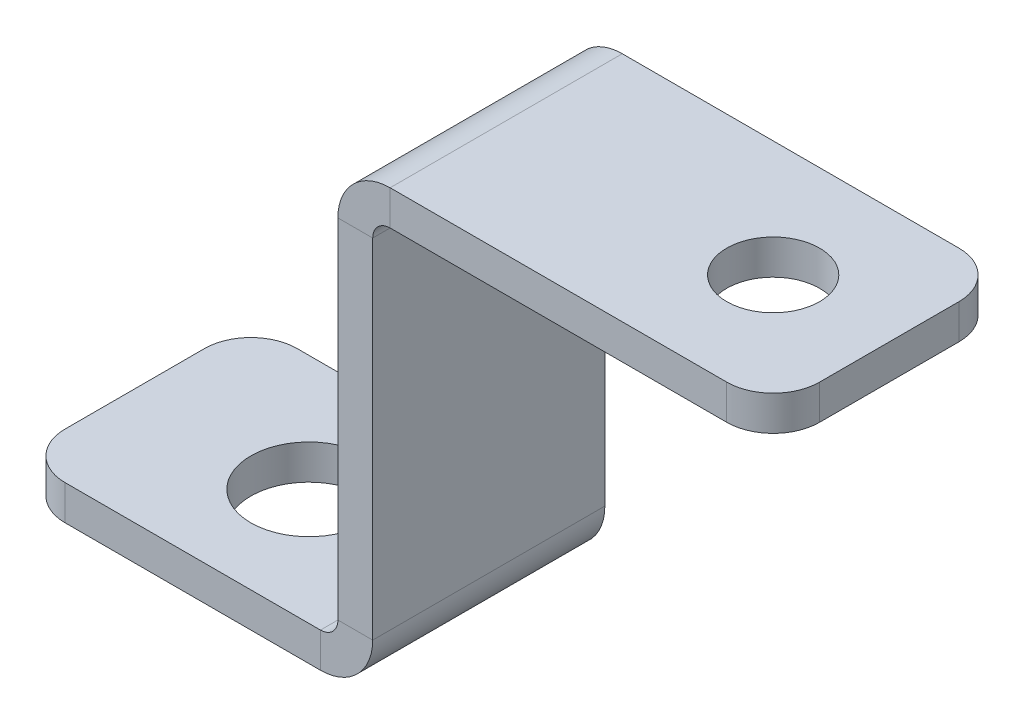
ISO-10303-21;
HEADER;
FILE_DESCRIPTION(('STEP AP214'),'2;1');
FILE_NAME('part.step','',(''),(''),'','','');
FILE_SCHEMA(('AUTOMOTIVE_DESIGN { 1 0 10303 214 1 1 1 1 }'));
ENDSEC;
DATA;
#1=APPLICATION_CONTEXT('core data for automotive mechanical design processes');
#2=APPLICATION_PROTOCOL_DEFINITION('international standard','automotive_design',2000,#1);
#3=PRODUCT_CONTEXT('',#1,'mechanical');
#4=PRODUCT('Part','Part','',(#3));
#5=PRODUCT_RELATED_PRODUCT_CATEGORY('part','',(#4));
#6=PRODUCT_DEFINITION_FORMATION('','',#4);
#7=PRODUCT_DEFINITION_CONTEXT('part definition',#1,'design');
#8=PRODUCT_DEFINITION('design','',#6,#7);
#9=PRODUCT_DEFINITION_SHAPE('','',#8);
#10=(LENGTH_UNIT() NAMED_UNIT(*) SI_UNIT(.MILLI.,.METRE.));
#11=(NAMED_UNIT(*) PLANE_ANGLE_UNIT() SI_UNIT($,.RADIAN.));
#12=(NAMED_UNIT(*) SI_UNIT($,.STERADIAN.) SOLID_ANGLE_UNIT());
#13=UNCERTAINTY_MEASURE_WITH_UNIT(LENGTH_MEASURE(1.E-05),#10,'distance_accuracy_value','');
#14=(GEOMETRIC_REPRESENTATION_CONTEXT(3) GLOBAL_UNCERTAINTY_ASSIGNED_CONTEXT((#13)) GLOBAL_UNIT_ASSIGNED_CONTEXT((#10,
#11,#12)) REPRESENTATION_CONTEXT('',''));
#15=CARTESIAN_POINT('',(0.,0.,0.));
#16=DIRECTION('',(0.,0.,1.));
#17=DIRECTION('',(1.,0.,0.));
#18=AXIS2_PLACEMENT_3D('',#15,#16,#17);
#19=CARTESIAN_POINT('',(13.75,0.75,10.));
#20=DIRECTION('',(0.,0.,1.));
#21=DIRECTION('',(1.,0.,0.));
#22=AXIS2_PLACEMENT_3D('',#19,#20,#21);
#23=PLANE('',#22);
#24=DIRECTION('',(1.,0.,0.));
#25=VECTOR('',#24,1.);
#26=CARTESIAN_POINT('',(13.75,0.75,10.));
#27=LINE('',#26,#25);
#28=CARTESIAN_POINT('',(13.75,0.75,10.));
#29=VERTEX_POINT('',#28);
#30=CARTESIAN_POINT('',(15.25,0.75,10.));
#31=VERTEX_POINT('',#30);
#32=EDGE_CURVE('E318',#29,#31,#27,.T.);
#33=ORIENTED_EDGE('',*,*,#32,.F.);
#34=CARTESIAN_POINT('',(13.,0.75,10.));
#35=DIRECTION('',(0.,0.,-1.));
#36=DIRECTION('',(-1.,0.,0.));
#37=AXIS2_PLACEMENT_3D('',#34,#35,#36);
#38=CIRCLE('',#37,0.75);
#39=CARTESIAN_POINT('',(13.,0.,10.));
#40=VERTEX_POINT('',#39);
#41=EDGE_CURVE('E203',#40,#29,#38,.F.);
#42=ORIENTED_EDGE('',*,*,#41,.F.);
#43=DIRECTION('',(0.,1.,0.));
#44=VECTOR('',#43,1.);
#45=CARTESIAN_POINT('',(13.,-1.5,10.));
#46=LINE('',#45,#44);
#47=CARTESIAN_POINT('',(13.,-1.5,10.));
#48=VERTEX_POINT('',#47);
#49=EDGE_CURVE('E314',#48,#40,#46,.T.);
#50=ORIENTED_EDGE('',*,*,#49,.F.);
#51=CARTESIAN_POINT('',(13.,0.75,10.));
#52=DIRECTION('',(0.,0.,1.));
#53=DIRECTION('',(1.,0.,0.));
#54=AXIS2_PLACEMENT_3D('',#51,#52,#53);
#55=CIRCLE('',#54,2.25);
#56=EDGE_CURVE('E216',#48,#31,#55,.T.);
#57=ORIENTED_EDGE('',*,*,#56,.T.);
#58=EDGE_LOOP('',(#33,#42,#50,#57));
#59=FACE_BOUND('',#58,.T.);
#60=ADVANCED_FACE('F41',(#59),#23,.T.);
#61=CARTESIAN_POINT('',(13.,-1.5,10.));
#62=DIRECTION('',(0.,0.,1.));
#63=DIRECTION('',(1.,0.,0.));
#64=AXIS2_PLACEMENT_3D('',#61,#62,#63);
#65=PLANE('',#64);
#66=DIRECTION('',(0.,1.,0.));
#67=VECTOR('',#66,1.);
#68=CARTESIAN_POINT('',(13.75,0.,10.));
#69=LINE('',#68,#67);
#70=CARTESIAN_POINT('',(13.75,15.75,10.));
#71=VERTEX_POINT('',#70);
#72=EDGE_CURVE('E200',#29,#71,#69,.T.);
#73=ORIENTED_EDGE('',*,*,#72,.F.);
#74=ORIENTED_EDGE('',*,*,#32,.T.);
#75=DIRECTION('',(0.,1.,0.));
#76=VECTOR('',#75,1.);
#77=CARTESIAN_POINT('',(15.25,0.,10.));
#78=LINE('',#77,#76);
#79=CARTESIAN_POINT('',(15.25,15.75,10.));
#80=VERTEX_POINT('',#79);
#81=EDGE_CURVE('E220',#31,#80,#78,.T.);
#82=ORIENTED_EDGE('',*,*,#81,.T.);
#83=DIRECTION('',(-1.,0.,0.));
#84=VECTOR('',#83,1.);
#85=CARTESIAN_POINT('',(15.25,15.75,10.));
#86=LINE('',#85,#84);
#87=EDGE_CURVE('E170',#80,#71,#86,.T.);
#88=ORIENTED_EDGE('',*,*,#87,.T.);
#89=EDGE_LOOP('',(#73,#74,#82,#88));
#90=FACE_BOUND('',#89,.T.);
#91=ADVANCED_FACE('F400',(#90),#65,.T.);
#92=CARTESIAN_POINT('',(13.,0.,0.));
#93=DIRECTION('',(0.,0.,-1.));
#94=DIRECTION('',(-1.,0.,0.));
#95=AXIS2_PLACEMENT_3D('',#92,#93,#94);
#96=PLANE('',#95);
#97=DIRECTION('',(0.,-1.,0.));
#98=VECTOR('',#97,1.);
#99=CARTESIAN_POINT('',(13.,0.,0.));
#100=LINE('',#99,#98);
#101=CARTESIAN_POINT('',(13.,0.,0.));
#102=VERTEX_POINT('',#101);
#103=CARTESIAN_POINT('',(13.,-1.5,0.));
#104=VERTEX_POINT('',#103);
#105=EDGE_CURVE('E310',#102,#104,#100,.T.);
#106=ORIENTED_EDGE('',*,*,#105,.F.);
#107=CARTESIAN_POINT('',(13.,0.75,0.));
#108=DIRECTION('',(0.,0.,-1.));
#109=DIRECTION('',(-1.,0.,0.));
#110=AXIS2_PLACEMENT_3D('',#107,#108,#109);
#111=CIRCLE('',#110,0.75);
#112=CARTESIAN_POINT('',(13.75,0.75,0.));
#113=VERTEX_POINT('',#112);
#114=EDGE_CURVE('E241',#102,#113,#111,.F.);
#115=ORIENTED_EDGE('',*,*,#114,.T.);
#116=DIRECTION('',(-1.,0.,0.));
#117=VECTOR('',#116,1.);
#118=CARTESIAN_POINT('',(15.25,0.75,0.));
#119=LINE('',#118,#117);
#120=CARTESIAN_POINT('',(15.25,0.75,0.));
#121=VERTEX_POINT('',#120);
#122=EDGE_CURVE('E169',#121,#113,#119,.T.);
#123=ORIENTED_EDGE('',*,*,#122,.F.);
#124=CARTESIAN_POINT('',(13.,0.75,0.));
#125=DIRECTION('',(0.,0.,1.));
#126=DIRECTION('',(1.,0.,0.));
#127=AXIS2_PLACEMENT_3D('',#124,#125,#126);
#128=CIRCLE('',#127,2.25);
#129=EDGE_CURVE('E251',#104,#121,#128,.T.);
#130=ORIENTED_EDGE('',*,*,#129,.F.);
#131=EDGE_LOOP('',(#106,#115,#123,#130));
#132=FACE_BOUND('',#131,.T.);
#133=ADVANCED_FACE('F450',(#132),#96,.T.);
#134=CARTESIAN_POINT('',(15.25,0.75,0.));
#135=DIRECTION('',(0.,0.,-1.));
#136=DIRECTION('',(-1.,0.,0.));
#137=AXIS2_PLACEMENT_3D('',#134,#135,#136);
#138=PLANE('',#137);
#139=DIRECTION('',(1.,0.,0.));
#140=VECTOR('',#139,1.);
#141=CARTESIAN_POINT('',(0.,-1.5,0.));
#142=LINE('',#141,#140);
#143=CARTESIAN_POINT('',(2.,-1.5,0.));
#144=VERTEX_POINT('',#143);
#145=EDGE_CURVE('E248',#144,#104,#142,.T.);
#146=ORIENTED_EDGE('',*,*,#145,.F.);
#147=DIRECTION('',(0.,1.,0.));
#148=VECTOR('',#147,1.);
#149=CARTESIAN_POINT('',(2.,0.75,0.));
#150=LINE('',#149,#148);
#151=CARTESIAN_POINT('',(2.,0.,0.));
#152=VERTEX_POINT('',#151);
#153=EDGE_CURVE('E346',#144,#152,#150,.T.);
#154=ORIENTED_EDGE('',*,*,#153,.T.);
#155=DIRECTION('',(1.,0.,0.));
#156=VECTOR('',#155,1.);
#157=CARTESIAN_POINT('',(0.,0.,0.));
#158=LINE('',#157,#156);
#159=EDGE_CURVE('E245',#152,#102,#158,.T.);
#160=ORIENTED_EDGE('',*,*,#159,.T.);
#161=ORIENTED_EDGE('',*,*,#105,.T.);
#162=EDGE_LOOP('',(#146,#154,#160,#161));
#163=FACE_BOUND('',#162,.T.);
#164=ADVANCED_FACE('F373',(#163),#138,.T.);
#165=CARTESIAN_POINT('',(16.,18.,10.));
#166=DIRECTION('',(0.,0.,1.));
#167=DIRECTION('',(1.,0.,0.));
#168=AXIS2_PLACEMENT_3D('',#165,#166,#167);
#169=PLANE('',#168);
#170=DIRECTION('',(0.,-1.,0.));
#171=VECTOR('',#170,1.);
#172=CARTESIAN_POINT('',(16.,18.,10.));
#173=LINE('',#172,#171);
#174=CARTESIAN_POINT('',(16.,18.,10.));
#175=VERTEX_POINT('',#174);
#176=CARTESIAN_POINT('',(16.,16.5,10.));
#177=VERTEX_POINT('',#176);
#178=EDGE_CURVE('E156',#175,#177,#173,.T.);
#179=ORIENTED_EDGE('',*,*,#178,.F.);
#180=CARTESIAN_POINT('',(16.,15.75,10.));
#181=DIRECTION('',(0.,0.,1.));
#182=DIRECTION('',(1.,0.,0.));
#183=AXIS2_PLACEMENT_3D('',#180,#181,#182);
#184=CIRCLE('',#183,2.25);
#185=EDGE_CURVE('E160',#71,#175,#184,.F.);
#186=ORIENTED_EDGE('',*,*,#185,.F.);
#187=ORIENTED_EDGE('',*,*,#87,.F.);
#188=CARTESIAN_POINT('',(16.,15.75,10.));
#189=DIRECTION('',(0.,0.,1.));
#190=DIRECTION('',(1.,0.,0.));
#191=AXIS2_PLACEMENT_3D('',#188,#189,#190);
#192=CIRCLE('',#191,0.75);
#193=EDGE_CURVE('E163',#80,#177,#192,.F.);
#194=ORIENTED_EDGE('',*,*,#193,.T.);
#195=EDGE_LOOP('',(#179,#186,#187,#194));
#196=FACE_BOUND('',#195,.T.);
#197=ADVANCED_FACE('F158',(#196),#169,.T.);
#198=CARTESIAN_POINT('',(15.25,15.75,10.));
#199=DIRECTION('',(0.,0.,1.));
#200=DIRECTION('',(1.,0.,0.));
#201=AXIS2_PLACEMENT_3D('',#198,#199,#200);
#202=PLANE('',#201);
#203=DIRECTION('',(1.,0.,0.));
#204=VECTOR('',#203,1.);
#205=CARTESIAN_POINT('',(13.75,16.5,10.));
#206=LINE('',#205,#204);
#207=CARTESIAN_POINT('',(30.5,16.5,10.));
#208=VERTEX_POINT('',#207);
#209=EDGE_CURVE('E194',#177,#208,#206,.T.);
#210=ORIENTED_EDGE('',*,*,#209,.T.);
#211=DIRECTION('',(0.,-1.,0.));
#212=VECTOR('',#211,1.);
#213=CARTESIAN_POINT('',(30.5,15.75,10.));
#214=LINE('',#213,#212);
#215=CARTESIAN_POINT('',(30.5,18.,10.));
#216=VERTEX_POINT('',#215);
#217=EDGE_CURVE('E192',#208,#216,#214,.F.);
#218=ORIENTED_EDGE('',*,*,#217,.T.);
#219=DIRECTION('',(1.,0.,0.));
#220=VECTOR('',#219,1.);
#221=CARTESIAN_POINT('',(13.75,18.,10.));
#222=LINE('',#221,#220);
#223=EDGE_CURVE('E179',#175,#216,#222,.T.);
#224=ORIENTED_EDGE('',*,*,#223,.F.);
#225=ORIENTED_EDGE('',*,*,#178,.T.);
#226=EDGE_LOOP('',(#210,#218,#224,#225));
#227=FACE_BOUND('',#226,.T.);
#228=ADVANCED_FACE('F190',(#227),#202,.T.);
#229=CARTESIAN_POINT('',(13.75,15.75,0.));
#230=DIRECTION('',(0.,0.,-1.));
#231=DIRECTION('',(-1.,0.,0.));
#232=AXIS2_PLACEMENT_3D('',#229,#230,#231);
#233=PLANE('',#232);
#234=DIRECTION('',(1.,0.,0.));
#235=VECTOR('',#234,1.);
#236=CARTESIAN_POINT('',(13.75,15.75,0.));
#237=LINE('',#236,#235);
#238=CARTESIAN_POINT('',(13.75,15.75,0.));
#239=VERTEX_POINT('',#238);
#240=CARTESIAN_POINT('',(15.25,15.75,0.));
#241=VERTEX_POINT('',#240);
#242=EDGE_CURVE('E303',#239,#241,#237,.T.);
#243=ORIENTED_EDGE('',*,*,#242,.F.);
#244=CARTESIAN_POINT('',(16.,15.75,0.));
#245=DIRECTION('',(0.,0.,1.));
#246=DIRECTION('',(1.,0.,0.));
#247=AXIS2_PLACEMENT_3D('',#244,#245,#246);
#248=CIRCLE('',#247,2.25);
#249=CARTESIAN_POINT('',(16.,18.,0.));
#250=VERTEX_POINT('',#249);
#251=EDGE_CURVE('E234',#239,#250,#248,.F.);
#252=ORIENTED_EDGE('',*,*,#251,.T.);
#253=DIRECTION('',(0.,1.,0.));
#254=VECTOR('',#253,1.);
#255=CARTESIAN_POINT('',(16.,16.5,0.));
#256=LINE('',#255,#254);
#257=CARTESIAN_POINT('',(16.,16.5,0.));
#258=VERTEX_POINT('',#257);
#259=EDGE_CURVE('E300',#258,#250,#256,.T.);
#260=ORIENTED_EDGE('',*,*,#259,.F.);
#261=CARTESIAN_POINT('',(16.,15.75,0.));
#262=DIRECTION('',(0.,0.,1.));
#263=DIRECTION('',(1.,0.,0.));
#264=AXIS2_PLACEMENT_3D('',#261,#262,#263);
#265=CIRCLE('',#264,0.75);
#266=EDGE_CURVE('E259',#241,#258,#265,.F.);
#267=ORIENTED_EDGE('',*,*,#266,.F.);
#268=EDGE_LOOP('',(#243,#252,#260,#267));
#269=FACE_BOUND('',#268,.T.);
#270=ADVANCED_FACE('F579',(#269),#233,.T.);
#271=CARTESIAN_POINT('',(16.,16.5,0.));
#272=DIRECTION('',(0.,0.,-1.));
#273=DIRECTION('',(-1.,0.,0.));
#274=AXIS2_PLACEMENT_3D('',#271,#272,#273);
#275=PLANE('',#274);
#276=DIRECTION('',(0.,1.,0.));
#277=VECTOR('',#276,1.);
#278=CARTESIAN_POINT('',(13.75,0.,0.));
#279=LINE('',#278,#277);
#280=EDGE_CURVE('E237',#113,#239,#279,.T.);
#281=ORIENTED_EDGE('',*,*,#280,.T.);
#282=ORIENTED_EDGE('',*,*,#242,.T.);
#283=DIRECTION('',(0.,1.,0.));
#284=VECTOR('',#283,1.);
#285=CARTESIAN_POINT('',(15.25,0.,0.));
#286=LINE('',#285,#284);
#287=EDGE_CURVE('E255',#121,#241,#286,.T.);
#288=ORIENTED_EDGE('',*,*,#287,.F.);
#289=ORIENTED_EDGE('',*,*,#122,.T.);
#290=EDGE_LOOP('',(#281,#282,#288,#289));
#291=FACE_BOUND('',#290,.T.);
#292=ADVANCED_FACE('F566',(#291),#275,.T.);
#293=CARTESIAN_POINT('',(13.75,16.5,10.));
#294=DIRECTION('',(0.,1.,0.));
#295=DIRECTION('',(0.,0.,1.));
#296=AXIS2_PLACEMENT_3D('',#293,#294,#295);
#297=PLANE('',#296);
#298=CARTESIAN_POINT('',(27.5,16.5,5.));
#299=DIRECTION('',(0.,1.,0.));
#300=DIRECTION('',(0.,0.,1.));
#301=AXIS2_PLACEMENT_3D('',#298,#299,#300);
#302=CIRCLE('',#301,2.);
#303=CARTESIAN_POINT('',(27.5,16.5,7.));
#304=VERTEX_POINT('',#303);
#305=EDGE_CURVE('E420',#304,#304,#302,.T.);
#306=ORIENTED_EDGE('',*,*,#305,.T.);
#307=EDGE_LOOP('',(#306));
#308=FACE_BOUND('',#307,.T.);
#309=DIRECTION('',(1.,0.,0.));
#310=VECTOR('',#309,1.);
#311=CARTESIAN_POINT('',(13.75,16.5,0.));
#312=LINE('',#311,#310);
#313=CARTESIAN_POINT('',(30.5,16.5,0.));
#314=VERTEX_POINT('',#313);
#315=EDGE_CURVE('E227',#258,#314,#312,.T.);
#316=ORIENTED_EDGE('',*,*,#315,.T.);
#317=CARTESIAN_POINT('',(30.5,16.5,2.));
#318=DIRECTION('',(0.,1.,0.));
#319=DIRECTION('',(0.,0.,1.));
#320=AXIS2_PLACEMENT_3D('',#317,#318,#319);
#321=CIRCLE('',#320,2.);
#322=CARTESIAN_POINT('',(32.5,16.5,2.));
#323=VERTEX_POINT('',#322);
#324=EDGE_CURVE('E328',#314,#323,#321,.F.);
#325=ORIENTED_EDGE('',*,*,#324,.T.);
#326=DIRECTION('',(0.,0.,-1.));
#327=VECTOR('',#326,1.);
#328=CARTESIAN_POINT('',(32.5,16.5,10.));
#329=LINE('',#328,#327);
#330=CARTESIAN_POINT('',(32.5,16.5,8.));
#331=VERTEX_POINT('',#330);
#332=EDGE_CURVE('E296',#331,#323,#329,.T.);
#333=ORIENTED_EDGE('',*,*,#332,.F.);
#334=CARTESIAN_POINT('',(30.5,16.5,8.));
#335=DIRECTION('',(0.,1.,0.));
#336=DIRECTION('',(0.,0.,1.));
#337=AXIS2_PLACEMENT_3D('',#334,#335,#336);
#338=CIRCLE('',#337,2.);
#339=EDGE_CURVE('E325',#331,#208,#338,.F.);
#340=ORIENTED_EDGE('',*,*,#339,.T.);
#341=ORIENTED_EDGE('',*,*,#209,.F.);
#342=DIRECTION('',(0.,0.,-1.));
#343=VECTOR('',#342,1.);
#344=CARTESIAN_POINT('',(16.,16.5,10.));
#345=LINE('',#344,#343);
#346=EDGE_CURVE('E226',#177,#258,#345,.T.);
#347=ORIENTED_EDGE('',*,*,#346,.T.);
#348=EDGE_LOOP('',(#316,#325,#333,#340,#341,#347));
#349=FACE_BOUND('',#348,.T.);
#350=ADVANCED_FACE('F412',(#308,#349),#297,.F.);
#351=CARTESIAN_POINT('',(32.5,18.,10.));
#352=DIRECTION('',(1.,0.,0.));
#353=DIRECTION('',(0.,0.,-1.));
#354=AXIS2_PLACEMENT_3D('',#351,#352,#353);
#355=PLANE('',#354);
#356=ORIENTED_EDGE('',*,*,#332,.T.);
#357=DIRECTION('',(0.,-1.,0.));
#358=VECTOR('',#357,1.);
#359=CARTESIAN_POINT('',(32.5,18.,2.));
#360=LINE('',#359,#358);
#361=CARTESIAN_POINT('',(32.5,18.,2.));
#362=VERTEX_POINT('',#361);
#363=EDGE_CURVE('E335',#323,#362,#360,.F.);
#364=ORIENTED_EDGE('',*,*,#363,.T.);
#365=DIRECTION('',(0.,0.,-1.));
#366=VECTOR('',#365,1.);
#367=CARTESIAN_POINT('',(32.5,18.,10.));
#368=LINE('',#367,#366);
#369=CARTESIAN_POINT('',(32.5,18.,8.));
#370=VERTEX_POINT('',#369);
#371=EDGE_CURVE('E187',#370,#362,#368,.T.);
#372=ORIENTED_EDGE('',*,*,#371,.F.);
#373=DIRECTION('',(0.,-1.,0.));
#374=VECTOR('',#373,1.);
#375=CARTESIAN_POINT('',(32.5,18.,8.));
#376=LINE('',#375,#374);
#377=EDGE_CURVE('E331',#370,#331,#376,.T.);
#378=ORIENTED_EDGE('',*,*,#377,.T.);
#379=EDGE_LOOP('',(#356,#364,#372,#378));
#380=FACE_BOUND('',#379,.T.);
#381=ADVANCED_FACE('F436',(#380),#355,.T.);
#382=CARTESIAN_POINT('',(13.75,18.,10.));
#383=DIRECTION('',(0.,1.,0.));
#384=DIRECTION('',(0.,0.,1.));
#385=AXIS2_PLACEMENT_3D('',#382,#383,#384);
#386=PLANE('',#385);
#387=CARTESIAN_POINT('',(27.5,18.,5.));
#388=DIRECTION('',(0.,1.,0.));
#389=DIRECTION('',(0.,0.,1.));
#390=AXIS2_PLACEMENT_3D('',#387,#388,#389);
#391=CIRCLE('',#390,2.);
#392=CARTESIAN_POINT('',(27.5,18.,7.));
#393=VERTEX_POINT('',#392);
#394=EDGE_CURVE('E427',#393,#393,#391,.T.);
#395=ORIENTED_EDGE('',*,*,#394,.F.);
#396=EDGE_LOOP('',(#395));
#397=FACE_BOUND('',#396,.T.);
#398=ORIENTED_EDGE('',*,*,#371,.T.);
#399=CARTESIAN_POINT('',(30.5,18.,2.));
#400=DIRECTION('',(0.,1.,0.));
#401=DIRECTION('',(0.,0.,1.));
#402=AXIS2_PLACEMENT_3D('',#399,#400,#401);
#403=CIRCLE('',#402,2.);
#404=CARTESIAN_POINT('',(30.5,18.,0.));
#405=VERTEX_POINT('',#404);
#406=EDGE_CURVE('E341',#362,#405,#403,.T.);
#407=ORIENTED_EDGE('',*,*,#406,.T.);
#408=DIRECTION('',(1.,0.,0.));
#409=VECTOR('',#408,1.);
#410=CARTESIAN_POINT('',(13.75,18.,0.));
#411=LINE('',#410,#409);
#412=EDGE_CURVE('E182',#250,#405,#411,.T.);
#413=ORIENTED_EDGE('',*,*,#412,.F.);
#414=DIRECTION('',(0.,0.,-1.));
#415=VECTOR('',#414,1.);
#416=CARTESIAN_POINT('',(16.,18.,10.));
#417=LINE('',#416,#415);
#418=EDGE_CURVE('E176',#175,#250,#417,.T.);
#419=ORIENTED_EDGE('',*,*,#418,.F.);
#420=ORIENTED_EDGE('',*,*,#223,.T.);
#421=CARTESIAN_POINT('',(30.5,18.,8.));
#422=DIRECTION('',(0.,1.,0.));
#423=DIRECTION('',(0.,0.,1.));
#424=AXIS2_PLACEMENT_3D('',#421,#422,#423);
#425=CIRCLE('',#424,2.);
#426=EDGE_CURVE('E338',#216,#370,#425,.T.);
#427=ORIENTED_EDGE('',*,*,#426,.T.);
#428=EDGE_LOOP('',(#398,#407,#413,#419,#420,#427));
#429=FACE_BOUND('',#428,.T.);
#430=ADVANCED_FACE('F178',(#397,#429),#386,.T.);
#431=CARTESIAN_POINT('',(16.,15.75,10.));
#432=DIRECTION('',(0.,0.,-1.));
#433=DIRECTION('',(-1.,0.,0.));
#434=AXIS2_PLACEMENT_3D('',#431,#432,#433);
#435=CYLINDRICAL_SURFACE('',#434,2.25);
#436=ORIENTED_EDGE('',*,*,#251,.F.);
#437=DIRECTION('',(0.,0.,-1.));
#438=VECTOR('',#437,1.);
#439=CARTESIAN_POINT('',(13.75,15.75,10.));
#440=LINE('',#439,#438);
#441=EDGE_CURVE('E188',#71,#239,#440,.T.);
#442=ORIENTED_EDGE('',*,*,#441,.F.);
#443=ORIENTED_EDGE('',*,*,#185,.T.);
#444=ORIENTED_EDGE('',*,*,#418,.T.);
#445=EDGE_LOOP('',(#436,#442,#443,#444));
#446=FACE_BOUND('',#445,.T.);
#447=ADVANCED_FACE('F197',(#446),#435,.T.);
#448=CARTESIAN_POINT('',(13.75,0.,10.));
#449=DIRECTION('',(-1.,0.,0.));
#450=DIRECTION('',(0.,0.,1.));
#451=AXIS2_PLACEMENT_3D('',#448,#449,#450);
#452=PLANE('',#451);
#453=ORIENTED_EDGE('',*,*,#280,.F.);
#454=DIRECTION('',(0.,0.,-1.));
#455=VECTOR('',#454,1.);
#456=CARTESIAN_POINT('',(13.75,0.75,10.));
#457=LINE('',#456,#455);
#458=EDGE_CURVE('E288',#29,#113,#457,.T.);
#459=ORIENTED_EDGE('',*,*,#458,.F.);
#460=ORIENTED_EDGE('',*,*,#72,.T.);
#461=ORIENTED_EDGE('',*,*,#441,.T.);
#462=EDGE_LOOP('',(#453,#459,#460,#461));
#463=FACE_BOUND('',#462,.T.);
#464=ADVANCED_FACE('F399',(#463),#452,.T.);
#465=CARTESIAN_POINT('',(13.,0.75,10.));
#466=DIRECTION('',(0.,0.,-1.));
#467=DIRECTION('',(-1.,0.,0.));
#468=AXIS2_PLACEMENT_3D('',#465,#466,#467);
#469=CYLINDRICAL_SURFACE('',#468,0.75);
#470=ORIENTED_EDGE('',*,*,#114,.F.);
#471=DIRECTION('',(0.,0.,-1.));
#472=VECTOR('',#471,1.);
#473=CARTESIAN_POINT('',(13.,0.,10.));
#474=LINE('',#473,#472);
#475=EDGE_CURVE('E284',#40,#102,#474,.T.);
#476=ORIENTED_EDGE('',*,*,#475,.F.);
#477=ORIENTED_EDGE('',*,*,#41,.T.);
#478=ORIENTED_EDGE('',*,*,#458,.T.);
#479=EDGE_LOOP('',(#470,#476,#477,#478));
#480=FACE_BOUND('',#479,.T.);
#481=ADVANCED_FACE('F391',(#480),#469,.F.);
#482=CARTESIAN_POINT('',(0.,0.,10.));
#483=DIRECTION('',(0.,1.,0.));
#484=DIRECTION('',(0.,0.,1.));
#485=AXIS2_PLACEMENT_3D('',#482,#483,#484);
#486=PLANE('',#485);
#487=CARTESIAN_POINT('',(7.5,0.,5.));
#488=DIRECTION('',(0.,1.,0.));
#489=DIRECTION('',(0.,0.,1.));
#490=AXIS2_PLACEMENT_3D('',#487,#488,#489);
#491=CIRCLE('',#490,2.5);
#492=CARTESIAN_POINT('',(7.5,0.,7.5));
#493=VERTEX_POINT('',#492);
#494=EDGE_CURVE('E416',#493,#493,#491,.T.);
#495=ORIENTED_EDGE('',*,*,#494,.F.);
#496=EDGE_LOOP('',(#495));
#497=FACE_BOUND('',#496,.T.);
#498=ORIENTED_EDGE('',*,*,#159,.F.);
#499=CARTESIAN_POINT('',(2.,0.,2.));
#500=DIRECTION('',(0.,1.,0.));
#501=DIRECTION('',(0.,0.,1.));
#502=AXIS2_PLACEMENT_3D('',#499,#500,#501);
#503=CIRCLE('',#502,2.);
#504=CARTESIAN_POINT('',(0.,0.,2.));
#505=VERTEX_POINT('',#504);
#506=EDGE_CURVE('E353',#152,#505,#503,.T.);
#507=ORIENTED_EDGE('',*,*,#506,.T.);
#508=DIRECTION('',(0.,0.,-1.));
#509=VECTOR('',#508,1.);
#510=CARTESIAN_POINT('',(0.,0.,10.));
#511=LINE('',#510,#509);
#512=CARTESIAN_POINT('',(0.,0.,8.));
#513=VERTEX_POINT('',#512);
#514=EDGE_CURVE('E281',#513,#505,#511,.T.);
#515=ORIENTED_EDGE('',*,*,#514,.F.);
#516=CARTESIAN_POINT('',(2.,0.,8.));
#517=DIRECTION('',(0.,1.,0.));
#518=DIRECTION('',(0.,0.,1.));
#519=AXIS2_PLACEMENT_3D('',#516,#517,#518);
#520=CIRCLE('',#519,2.);
#521=CARTESIAN_POINT('',(2.,0.,10.));
#522=VERTEX_POINT('',#521);
#523=EDGE_CURVE('E350',#513,#522,#520,.T.);
#524=ORIENTED_EDGE('',*,*,#523,.T.);
#525=DIRECTION('',(1.,0.,0.));
#526=VECTOR('',#525,1.);
#527=CARTESIAN_POINT('',(0.,0.,10.));
#528=LINE('',#527,#526);
#529=EDGE_CURVE('E210',#522,#40,#528,.T.);
#530=ORIENTED_EDGE('',*,*,#529,.T.);
#531=ORIENTED_EDGE('',*,*,#475,.T.);
#532=EDGE_LOOP('',(#498,#507,#515,#524,#530,#531));
#533=FACE_BOUND('',#532,.T.);
#534=ADVANCED_FACE('F379',(#497,#533),#486,.T.);
#535=CARTESIAN_POINT('',(0.,-1.5,10.));
#536=DIRECTION('',(-1.,0.,0.));
#537=DIRECTION('',(0.,0.,1.));
#538=AXIS2_PLACEMENT_3D('',#535,#536,#537);
#539=PLANE('',#538);
#540=ORIENTED_EDGE('',*,*,#514,.T.);
#541=DIRECTION('',(0.,1.,0.));
#542=VECTOR('',#541,1.);
#543=CARTESIAN_POINT('',(0.,-1.5,2.));
#544=LINE('',#543,#542);
#545=CARTESIAN_POINT('',(0.,-1.5,2.));
#546=VERTEX_POINT('',#545);
#547=EDGE_CURVE('E63',#505,#546,#544,.F.);
#548=ORIENTED_EDGE('',*,*,#547,.T.);
#549=DIRECTION('',(0.,0.,-1.));
#550=VECTOR('',#549,1.);
#551=CARTESIAN_POINT('',(0.,-1.5,10.));
#552=LINE('',#551,#550);
#553=CARTESIAN_POINT('',(0.,-1.5,8.));
#554=VERTEX_POINT('',#553);
#555=EDGE_CURVE('E278',#554,#546,#552,.T.);
#556=ORIENTED_EDGE('',*,*,#555,.F.);
#557=DIRECTION('',(0.,1.,0.));
#558=VECTOR('',#557,1.);
#559=CARTESIAN_POINT('',(0.,-1.5,8.));
#560=LINE('',#559,#558);
#561=EDGE_CURVE('E356',#554,#513,#560,.T.);
#562=ORIENTED_EDGE('',*,*,#561,.T.);
#563=EDGE_LOOP('',(#540,#548,#556,#562));
#564=FACE_BOUND('',#563,.T.);
#565=ADVANCED_FACE('F380',(#564),#539,.T.);
#566=CARTESIAN_POINT('',(0.,-1.5,10.));
#567=DIRECTION('',(0.,1.,0.));
#568=DIRECTION('',(0.,0.,1.));
#569=AXIS2_PLACEMENT_3D('',#566,#567,#568);
#570=PLANE('',#569);
#571=CARTESIAN_POINT('',(7.5,-1.5,5.));
#572=DIRECTION('',(0.,1.,0.));
#573=DIRECTION('',(0.,0.,1.));
#574=AXIS2_PLACEMENT_3D('',#571,#572,#573);
#575=CIRCLE('',#574,2.5);
#576=CARTESIAN_POINT('',(7.5,-1.5,7.5));
#577=VERTEX_POINT('',#576);
#578=EDGE_CURVE('E231',#577,#577,#575,.T.);
#579=ORIENTED_EDGE('',*,*,#578,.T.);
#580=EDGE_LOOP('',(#579));
#581=FACE_BOUND('',#580,.T.);
#582=ORIENTED_EDGE('',*,*,#555,.T.);
#583=CARTESIAN_POINT('',(2.,-1.5,2.));
#584=DIRECTION('',(0.,1.,0.));
#585=DIRECTION('',(0.,0.,1.));
#586=AXIS2_PLACEMENT_3D('',#583,#584,#585);
#587=CIRCLE('',#586,2.);
#588=EDGE_CURVE('E50',#546,#144,#587,.F.);
#589=ORIENTED_EDGE('',*,*,#588,.T.);
#590=ORIENTED_EDGE('',*,*,#145,.T.);
#591=DIRECTION('',(0.,0.,-1.));
#592=VECTOR('',#591,1.);
#593=CARTESIAN_POINT('',(13.,-1.5,10.));
#594=LINE('',#593,#592);
#595=EDGE_CURVE('E274',#48,#104,#594,.T.);
#596=ORIENTED_EDGE('',*,*,#595,.F.);
#597=DIRECTION('',(1.,0.,0.));
#598=VECTOR('',#597,1.);
#599=CARTESIAN_POINT('',(0.,-1.5,10.));
#600=LINE('',#599,#598);
#601=CARTESIAN_POINT('',(2.,-1.5,10.));
#602=VERTEX_POINT('',#601);
#603=EDGE_CURVE('E213',#602,#48,#600,.T.);
#604=ORIENTED_EDGE('',*,*,#603,.F.);
#605=CARTESIAN_POINT('',(2.,-1.5,8.));
#606=DIRECTION('',(0.,1.,0.));
#607=DIRECTION('',(0.,0.,1.));
#608=AXIS2_PLACEMENT_3D('',#605,#606,#607);
#609=CIRCLE('',#608,2.);
#610=EDGE_CURVE('E362',#602,#554,#609,.F.);
#611=ORIENTED_EDGE('',*,*,#610,.T.);
#612=EDGE_LOOP('',(#582,#589,#590,#596,#604,#611));
#613=FACE_BOUND('',#612,.T.);
#614=ADVANCED_FACE('F368',(#581,#613),#570,.F.);
#615=CARTESIAN_POINT('',(13.,0.75,10.));
#616=DIRECTION('',(0.,0.,-1.));
#617=DIRECTION('',(-1.,0.,0.));
#618=AXIS2_PLACEMENT_3D('',#615,#616,#617);
#619=CYLINDRICAL_SURFACE('',#618,2.25);
#620=ORIENTED_EDGE('',*,*,#129,.T.);
#621=DIRECTION('',(0.,0.,-1.));
#622=VECTOR('',#621,1.);
#623=CARTESIAN_POINT('',(15.25,0.75,10.));
#624=LINE('',#623,#622);
#625=EDGE_CURVE('E270',#31,#121,#624,.T.);
#626=ORIENTED_EDGE('',*,*,#625,.F.);
#627=ORIENTED_EDGE('',*,*,#56,.F.);
#628=ORIENTED_EDGE('',*,*,#595,.T.);
#629=EDGE_LOOP('',(#620,#626,#627,#628));
#630=FACE_BOUND('',#629,.T.);
#631=ADVANCED_FACE('F519',(#630),#619,.T.);
#632=CARTESIAN_POINT('',(15.25,0.,10.));
#633=DIRECTION('',(-1.,0.,0.));
#634=DIRECTION('',(0.,0.,1.));
#635=AXIS2_PLACEMENT_3D('',#632,#633,#634);
#636=PLANE('',#635);
#637=ORIENTED_EDGE('',*,*,#287,.T.);
#638=DIRECTION('',(0.,0.,-1.));
#639=VECTOR('',#638,1.);
#640=CARTESIAN_POINT('',(15.25,15.75,10.));
#641=LINE('',#640,#639);
#642=EDGE_CURVE('E266',#80,#241,#641,.T.);
#643=ORIENTED_EDGE('',*,*,#642,.F.);
#644=ORIENTED_EDGE('',*,*,#81,.F.);
#645=ORIENTED_EDGE('',*,*,#625,.T.);
#646=EDGE_LOOP('',(#637,#643,#644,#645));
#647=FACE_BOUND('',#646,.T.);
#648=ADVANCED_FACE('F404',(#647),#636,.F.);
#649=CARTESIAN_POINT('',(16.,15.75,10.));
#650=DIRECTION('',(0.,0.,-1.));
#651=DIRECTION('',(-1.,0.,0.));
#652=AXIS2_PLACEMENT_3D('',#649,#650,#651);
#653=CYLINDRICAL_SURFACE('',#652,0.75);
#654=ORIENTED_EDGE('',*,*,#266,.T.);
#655=ORIENTED_EDGE('',*,*,#346,.F.);
#656=ORIENTED_EDGE('',*,*,#193,.F.);
#657=ORIENTED_EDGE('',*,*,#642,.T.);
#658=EDGE_LOOP('',(#654,#655,#656,#657));
#659=FACE_BOUND('',#658,.T.);
#660=ADVANCED_FACE('F408',(#659),#653,.F.);
#661=CARTESIAN_POINT('',(16.,15.75,10.));
#662=DIRECTION('',(0.,0.,1.));
#663=DIRECTION('',(1.,0.,0.));
#664=AXIS2_PLACEMENT_3D('',#661,#662,#663);
#665=PLANE('',#664);
#666=ORIENTED_EDGE('',*,*,#529,.F.);
#667=DIRECTION('',(0.,1.,0.));
#668=VECTOR('',#667,1.);
#669=CARTESIAN_POINT('',(2.,15.75,10.));
#670=LINE('',#669,#668);
#671=EDGE_CURVE('E11',#522,#602,#670,.F.);
#672=ORIENTED_EDGE('',*,*,#671,.T.);
#673=ORIENTED_EDGE('',*,*,#603,.T.);
#674=ORIENTED_EDGE('',*,*,#49,.T.);
#675=EDGE_LOOP('',(#666,#672,#673,#674));
#676=FACE_BOUND('',#675,.T.);
#677=ADVANCED_FACE('F384',(#676),#665,.T.);
#678=CARTESIAN_POINT('',(16.,15.75,0.));
#679=DIRECTION('',(0.,0.,1.));
#680=DIRECTION('',(1.,0.,0.));
#681=AXIS2_PLACEMENT_3D('',#678,#679,#680);
#682=PLANE('',#681);
#683=ORIENTED_EDGE('',*,*,#412,.T.);
#684=DIRECTION('',(0.,-1.,0.));
#685=VECTOR('',#684,1.);
#686=CARTESIAN_POINT('',(30.5,16.5,0.));
#687=LINE('',#686,#685);
#688=EDGE_CURVE('E321',#405,#314,#687,.T.);
#689=ORIENTED_EDGE('',*,*,#688,.T.);
#690=ORIENTED_EDGE('',*,*,#315,.F.);
#691=ORIENTED_EDGE('',*,*,#259,.T.);
#692=EDGE_LOOP('',(#683,#689,#690,#691));
#693=FACE_BOUND('',#692,.T.);
#694=ADVANCED_FACE('F490',(#693),#682,.F.);
#695=CARTESIAN_POINT('',(7.5,-1.5,5.));
#696=DIRECTION('',(0.,1.,0.));
#697=DIRECTION('',(0.,0.,1.));
#698=AXIS2_PLACEMENT_3D('',#695,#696,#697);
#699=CYLINDRICAL_SURFACE('',#698,2.5);
#700=CARTESIAN_POINT('',(7.5,-1.5,7.5));
#701=CARTESIAN_POINT('',(7.5,-1.484375,7.5));
#702=CARTESIAN_POINT('',(7.5,-1.46875,7.5));
#703=CARTESIAN_POINT('',(7.5,-1.4375,7.5));
#704=CARTESIAN_POINT('',(7.5,-1.421875,7.5));
#705=CARTESIAN_POINT('',(7.5,-1.390625,7.5));
#706=CARTESIAN_POINT('',(7.5,-1.375,7.5));
#707=CARTESIAN_POINT('',(7.5,-1.34375,7.5));
#708=CARTESIAN_POINT('',(7.5,-1.328125,7.5));
#709=CARTESIAN_POINT('',(7.5,-1.296875,7.5));
#710=CARTESIAN_POINT('',(7.5,-1.28125,7.5));
#711=CARTESIAN_POINT('',(7.5,-1.25,7.5));
#712=CARTESIAN_POINT('',(7.5,-1.234375,7.5));
#713=CARTESIAN_POINT('',(7.5,-1.203125,7.5));
#714=CARTESIAN_POINT('',(7.5,-1.1875,7.5));
#715=CARTESIAN_POINT('',(7.5,-1.15625,7.5));
#716=CARTESIAN_POINT('',(7.5,-1.140625,7.5));
#717=CARTESIAN_POINT('',(7.5,-1.109375,7.5));
#718=CARTESIAN_POINT('',(7.5,-1.09375,7.5));
#719=CARTESIAN_POINT('',(7.5,-1.0625,7.5));
#720=CARTESIAN_POINT('',(7.5,-1.046875,7.5));
#721=CARTESIAN_POINT('',(7.5,-1.015625,7.5));
#722=CARTESIAN_POINT('',(7.5,-1.,7.5));
#723=CARTESIAN_POINT('',(7.5,-0.96875,7.5));
#724=CARTESIAN_POINT('',(7.5,-0.953125,7.5));
#725=CARTESIAN_POINT('',(7.5,-0.921875,7.5));
#726=CARTESIAN_POINT('',(7.5,-0.90625,7.5));
#727=CARTESIAN_POINT('',(7.5,-0.875,7.5));
#728=CARTESIAN_POINT('',(7.5,-0.859375,7.5));
#729=CARTESIAN_POINT('',(7.5,-0.828125,7.5));
#730=CARTESIAN_POINT('',(7.5,-0.8125,7.5));
#731=CARTESIAN_POINT('',(7.5,-0.78125,7.5));
#732=CARTESIAN_POINT('',(7.5,-0.765625,7.5));
#733=CARTESIAN_POINT('',(7.5,-0.734375,7.5));
#734=CARTESIAN_POINT('',(7.5,-0.71875,7.5));
#735=CARTESIAN_POINT('',(7.5,-0.6875,7.5));
#736=CARTESIAN_POINT('',(7.5,-0.671875,7.5));
#737=CARTESIAN_POINT('',(7.5,-0.640625,7.5));
#738=CARTESIAN_POINT('',(7.5,-0.625,7.5));
#739=CARTESIAN_POINT('',(7.5,-0.59375,7.5));
#740=CARTESIAN_POINT('',(7.5,-0.578125,7.5));
#741=CARTESIAN_POINT('',(7.5,-0.546875,7.5));
#742=CARTESIAN_POINT('',(7.5,-0.53125,7.5));
#743=CARTESIAN_POINT('',(7.5,-0.5,7.5));
#744=CARTESIAN_POINT('',(7.5,-0.484375,7.5));
#745=CARTESIAN_POINT('',(7.5,-0.453125,7.5));
#746=CARTESIAN_POINT('',(7.5,-0.4375,7.5));
#747=CARTESIAN_POINT('',(7.5,-0.40625,7.5));
#748=CARTESIAN_POINT('',(7.5,-0.390625,7.5));
#749=CARTESIAN_POINT('',(7.5,-0.359375,7.5));
#750=CARTESIAN_POINT('',(7.5,-0.34375,7.5));
#751=CARTESIAN_POINT('',(7.5,-0.3125,7.5));
#752=CARTESIAN_POINT('',(7.5,-0.296875,7.5));
#753=CARTESIAN_POINT('',(7.5,-0.265625,7.5));
#754=CARTESIAN_POINT('',(7.5,-0.25,7.5));
#755=CARTESIAN_POINT('',(7.5,-0.21875,7.5));
#756=CARTESIAN_POINT('',(7.5,-0.203125,7.5));
#757=CARTESIAN_POINT('',(7.5,-0.171875,7.5));
#758=CARTESIAN_POINT('',(7.5,-0.15625,7.5));
#759=CARTESIAN_POINT('',(7.5,-0.125,7.5));
#760=CARTESIAN_POINT('',(7.5,-0.109375,7.5));
#761=CARTESIAN_POINT('',(7.5,-0.0781250000000001,7.5));
#762=CARTESIAN_POINT('',(7.5,-0.0625000000000001,7.5));
#763=CARTESIAN_POINT('',(7.5,-0.03125,7.5));
#764=CARTESIAN_POINT('',(7.5,-0.015625,7.5));
#765=CARTESIAN_POINT('',(7.5,0.,7.5));
#766=B_SPLINE_CURVE_WITH_KNOTS('',3,(#700,#701,#702,#703,#704,#705,#706,#707,#708,#709,#710,
#711,#712,#713,#714,#715,#716,#717,#718,#719,#720,#721,#722,#723,#724,#725,#726,#727,#728,#729,
#730,#731,#732,#733,#734,#735,#736,#737,#738,#739,#740,#741,#742,#743,#744,#745,#746,#747,#748,
#749,#750,#751,#752,#753,#754,#755,#756,#757,#758,#759,#760,#761,#762,#763,#764,#765),
.UNSPECIFIED.,.F.,.F.,(4,2,2,2,2,2,2,2,2,2,2,2,2,2,2,2,2,2,2,2,2,2,2,2,2,2,2,2,2,2,2,2,4),(0.,
0.0468749999999998,0.0937499999999999,0.140625,0.1875,0.234375,0.28125,0.328125,0.375,0.421875,
0.46875,0.515625,0.5625,0.609375,0.65625,0.703125,0.75,0.796875,0.84375,0.890625,0.9375,
0.984375,1.03125,1.078125,1.125,1.171875,1.21875,1.265625,1.3125,1.359375,1.40625,1.453125,1.5),.UNSPECIFIED.);
#767=EDGE_CURVE('BSEAM495',#577,#493,#766,.T.);
#768=ORIENTED_EDGE('',*,*,#578,.F.);
#769=ORIENTED_EDGE('',*,*,#494,.T.);
#770=ORIENTED_EDGE('',*,*,#767,.T.);
#771=ORIENTED_EDGE('',*,*,#767,.F.);
#772=EDGE_LOOP('',(#768,#770,#769,#771));
#773=FACE_BOUND('',#772,.T.);
#774=ADVANCED_FACE('F495',(#773),#699,.F.);
#775=CARTESIAN_POINT('',(27.5,-1.5,5.));
#776=DIRECTION('',(0.,1.,0.));
#777=DIRECTION('',(0.,0.,1.));
#778=AXIS2_PLACEMENT_3D('',#775,#776,#777);
#779=CYLINDRICAL_SURFACE('',#778,2.);
#780=ORIENTED_EDGE('',*,*,#394,.T.);
#781=EDGE_LOOP('',(#780));
#782=FACE_BOUND('',#781,.T.);
#783=ORIENTED_EDGE('',*,*,#305,.F.);
#784=EDGE_LOOP('',(#783));
#785=FACE_BOUND('',#784,.T.);
#786=ADVANCED_FACE('F432',(#782,#785),#779,.F.);
#787=CARTESIAN_POINT('',(30.5,15.75,2.));
#788=DIRECTION('',(0.,1.,0.));
#789=DIRECTION('',(0.,0.,1.));
#790=AXIS2_PLACEMENT_3D('',#787,#788,#789);
#791=CYLINDRICAL_SURFACE('',#790,2.);
#792=ORIENTED_EDGE('',*,*,#406,.F.);
#793=ORIENTED_EDGE('',*,*,#363,.F.);
#794=ORIENTED_EDGE('',*,*,#324,.F.);
#795=ORIENTED_EDGE('',*,*,#688,.F.);
#796=EDGE_LOOP('',(#792,#793,#794,#795));
#797=FACE_BOUND('',#796,.T.);
#798=ADVANCED_FACE('F454',(#797),#791,.T.);
#799=CARTESIAN_POINT('',(30.5,18.,8.));
#800=DIRECTION('',(0.,-1.,0.));
#801=DIRECTION('',(0.,0.,-1.));
#802=AXIS2_PLACEMENT_3D('',#799,#800,#801);
#803=CYLINDRICAL_SURFACE('',#802,2.);
#804=ORIENTED_EDGE('',*,*,#426,.F.);
#805=ORIENTED_EDGE('',*,*,#217,.F.);
#806=ORIENTED_EDGE('',*,*,#339,.F.);
#807=ORIENTED_EDGE('',*,*,#377,.F.);
#808=EDGE_LOOP('',(#804,#805,#806,#807));
#809=FACE_BOUND('',#808,.T.);
#810=ADVANCED_FACE('F457',(#809),#803,.T.);
#811=CARTESIAN_POINT('',(2.,0.75,2.));
#812=DIRECTION('',(0.,1.,0.));
#813=DIRECTION('',(0.,0.,1.));
#814=AXIS2_PLACEMENT_3D('',#811,#812,#813);
#815=CYLINDRICAL_SURFACE('',#814,2.);
#816=ORIENTED_EDGE('',*,*,#588,.F.);
#817=ORIENTED_EDGE('',*,*,#547,.F.);
#818=ORIENTED_EDGE('',*,*,#506,.F.);
#819=ORIENTED_EDGE('',*,*,#153,.F.);
#820=EDGE_LOOP('',(#816,#817,#818,#819));
#821=FACE_BOUND('',#820,.T.);
#822=ADVANCED_FACE('F376',(#821),#815,.T.);
#823=CARTESIAN_POINT('',(2.,-1.5,8.));
#824=DIRECTION('',(0.,1.,0.));
#825=DIRECTION('',(0.,0.,1.));
#826=AXIS2_PLACEMENT_3D('',#823,#824,#825);
#827=CYLINDRICAL_SURFACE('',#826,2.);
#828=ORIENTED_EDGE('',*,*,#610,.F.);
#829=ORIENTED_EDGE('',*,*,#671,.F.);
#830=ORIENTED_EDGE('',*,*,#523,.F.);
#831=ORIENTED_EDGE('',*,*,#561,.F.);
#832=EDGE_LOOP('',(#828,#829,#830,#831));
#833=FACE_BOUND('',#832,.T.);
#834=ADVANCED_FACE('F43',(#833),#827,.T.);
#835=CLOSED_SHELL('',(#60,#91,#133,#164,#197,#228,#270,#292,#350,#381,#430,#447,#464,#481,#534,
#565,#614,#631,#648,#660,#677,#694,#774,#786,#798,#810,#822,#834));
#836=MANIFOLD_SOLID_BREP('B2',#835);
#837=ADVANCED_BREP_SHAPE_REPRESENTATION('',(#18,#836),#14);
#838=SHAPE_DEFINITION_REPRESENTATION(#9,#837);
ENDSEC;
END-ISO-10303-21;
